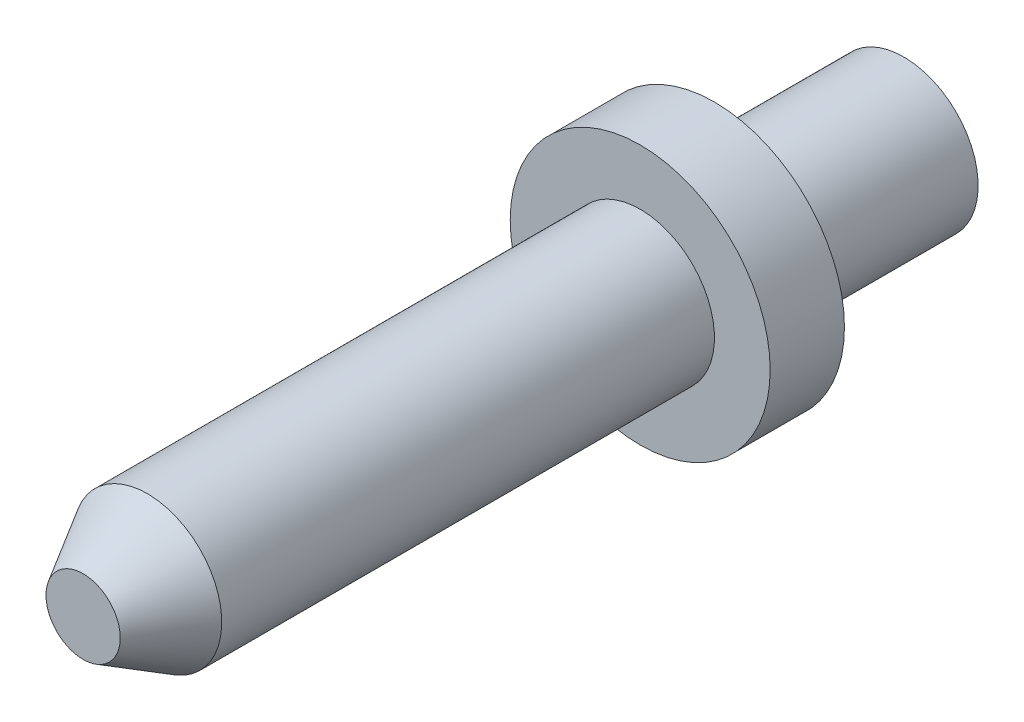
ISO-10303-21;
HEADER;
FILE_DESCRIPTION(('STEP AP214'),'2;1');
FILE_NAME('part.step','',(''),(''),'','','');
FILE_SCHEMA(('AUTOMOTIVE_DESIGN { 1 0 10303 214 1 1 1 1 }'));
ENDSEC;
DATA;
#1=APPLICATION_CONTEXT('core data for automotive mechanical design processes');
#2=APPLICATION_PROTOCOL_DEFINITION('international standard','automotive_design',2000,#1);
#3=PRODUCT_CONTEXT('',#1,'mechanical');
#4=PRODUCT('Part','Part','',(#3));
#5=PRODUCT_RELATED_PRODUCT_CATEGORY('part','',(#4));
#6=PRODUCT_DEFINITION_FORMATION('','',#4);
#7=PRODUCT_DEFINITION_CONTEXT('part definition',#1,'design');
#8=PRODUCT_DEFINITION('design','',#6,#7);
#9=PRODUCT_DEFINITION_SHAPE('','',#8);
#10=(LENGTH_UNIT() NAMED_UNIT(*) SI_UNIT(.MILLI.,.METRE.));
#11=(NAMED_UNIT(*) PLANE_ANGLE_UNIT() SI_UNIT($,.RADIAN.));
#12=(NAMED_UNIT(*) SI_UNIT($,.STERADIAN.) SOLID_ANGLE_UNIT());
#13=UNCERTAINTY_MEASURE_WITH_UNIT(LENGTH_MEASURE(1.E-05),#10,'distance_accuracy_value','');
#14=(GEOMETRIC_REPRESENTATION_CONTEXT(3) GLOBAL_UNCERTAINTY_ASSIGNED_CONTEXT((#13)) GLOBAL_UNIT_ASSIGNED_CONTEXT((#10,
#11,#12)) REPRESENTATION_CONTEXT('',''));
#15=CARTESIAN_POINT('',(0.,0.,0.));
#16=DIRECTION('',(0.,0.,1.));
#17=DIRECTION('',(1.,0.,0.));
#18=AXIS2_PLACEMENT_3D('',#15,#16,#17);
#19=CARTESIAN_POINT('',(0.,0.,-1.70210979481437));
#20=DIRECTION('',(0.,0.,-1.));
#21=DIRECTION('',(-1.,0.,0.));
#22=AXIS2_PLACEMENT_3D('',#19,#20,#21);
#23=CYLINDRICAL_SURFACE('',#22,0.508);
#24=CARTESIAN_POINT('',(0.,0.,-1.70210979481437));
#25=DIRECTION('',(0.,0.,-1.));
#26=DIRECTION('',(-1.,0.,0.));
#27=AXIS2_PLACEMENT_3D('',#24,#25,#26);
#28=CIRCLE('',#27,0.508);
#29=CARTESIAN_POINT('',(-0.508,0.,-1.70210979481437));
#30=VERTEX_POINT('',#29);
#31=EDGE_CURVE('E11',#30,#30,#28,.T.);
#32=ORIENTED_EDGE('',*,*,#31,.F.);
#33=EDGE_LOOP('',(#32));
#34=FACE_BOUND('',#33,.T.);
#35=CARTESIAN_POINT('',(0.,0.,1.66794930006314));
#36=DIRECTION('',(0.,0.,-1.));
#37=DIRECTION('',(-1.,0.,0.));
#38=AXIS2_PLACEMENT_3D('',#35,#36,#37);
#39=CIRCLE('',#38,0.508);
#40=CARTESIAN_POINT('',(-0.508,0.,1.66794930006314));
#41=VERTEX_POINT('',#40);
#42=EDGE_CURVE('E58',#41,#41,#39,.T.);
#43=ORIENTED_EDGE('',*,*,#42,.T.);
#44=EDGE_LOOP('',(#43));
#45=FACE_BOUND('',#44,.T.);
#46=ADVANCED_FACE('F32',(#34,#45),#23,.T.);
#47=CARTESIAN_POINT('',(0.,0.,-1.70210979481437));
#48=DIRECTION('',(0.,0.,-1.));
#49=DIRECTION('',(-1.,0.,0.));
#50=AXIS2_PLACEMENT_3D('',#47,#48,#49);
#51=PLANE('',#50);
#52=CARTESIAN_POINT('',(0.,0.,-1.70210979481437));
#53=DIRECTION('',(0.,0.,-1.));
#54=DIRECTION('',(-1.,0.,0.));
#55=AXIS2_PLACEMENT_3D('',#52,#53,#54);
#56=CIRCLE('',#55,0.889);
#57=CARTESIAN_POINT('',(-0.889,0.,-1.70210979481437));
#58=VERTEX_POINT('',#57);
#59=EDGE_CURVE('E38',#58,#58,#56,.T.);
#60=ORIENTED_EDGE('',*,*,#59,.F.);
#61=EDGE_LOOP('',(#60));
#62=FACE_BOUND('',#61,.T.);
#63=ORIENTED_EDGE('',*,*,#31,.T.);
#64=EDGE_LOOP('',(#63));
#65=FACE_BOUND('',#64,.T.);
#66=ADVANCED_FACE('F74',(#62,#65),#51,.F.);
#67=CARTESIAN_POINT('',(0.,0.,-1.70210979481437));
#68=DIRECTION('',(0.,0.,-1.));
#69=DIRECTION('',(-1.,0.,0.));
#70=AXIS2_PLACEMENT_3D('',#67,#68,#69);
#71=CYLINDRICAL_SURFACE('',#70,0.889);
#72=CARTESIAN_POINT('',(0.,0.,-2.21010979481437));
#73=DIRECTION('',(0.,0.,-1.));
#74=DIRECTION('',(-1.,0.,0.));
#75=AXIS2_PLACEMENT_3D('',#72,#73,#74);
#76=CIRCLE('',#75,0.889);
#77=CARTESIAN_POINT('',(-0.889,0.,-2.21010979481437));
#78=VERTEX_POINT('',#77);
#79=EDGE_CURVE('E67',#78,#78,#76,.T.);
#80=ORIENTED_EDGE('',*,*,#79,.F.);
#81=EDGE_LOOP('',(#80));
#82=FACE_BOUND('',#81,.T.);
#83=ORIENTED_EDGE('',*,*,#59,.T.);
#84=EDGE_LOOP('',(#83));
#85=FACE_BOUND('',#84,.T.);
#86=ADVANCED_FACE('F72',(#82,#85),#71,.T.);
#87=CARTESIAN_POINT('',(0.,0.,-2.21010979481437));
#88=DIRECTION('',(0.,0.,-1.));
#89=DIRECTION('',(-1.,0.,0.));
#90=AXIS2_PLACEMENT_3D('',#87,#88,#89);
#91=PLANE('',#90);
#92=ORIENTED_EDGE('',*,*,#79,.T.);
#93=EDGE_LOOP('',(#92));
#94=FACE_BOUND('',#93,.T.);
#95=CARTESIAN_POINT('',(0.,0.,-2.21010979481437));
#96=DIRECTION('',(0.,0.,-1.));
#97=DIRECTION('',(-1.,0.,0.));
#98=AXIS2_PLACEMENT_3D('',#95,#96,#97);
#99=CIRCLE('',#98,0.508);
#100=CARTESIAN_POINT('',(-0.508,0.,-2.21010979481437));
#101=VERTEX_POINT('',#100);
#102=EDGE_CURVE('E64',#101,#101,#99,.T.);
#103=ORIENTED_EDGE('',*,*,#102,.F.);
#104=EDGE_LOOP('',(#103));
#105=FACE_BOUND('',#104,.T.);
#106=ADVANCED_FACE('F103',(#94,#105),#91,.T.);
#107=CARTESIAN_POINT('',(0.,0.,-1.70210979481437));
#108=DIRECTION('',(0.,0.,-1.));
#109=DIRECTION('',(-1.,0.,0.));
#110=AXIS2_PLACEMENT_3D('',#107,#108,#109);
#111=CYLINDRICAL_SURFACE('',#110,0.508);
#112=CARTESIAN_POINT('',(0.,0.,-3.50550979481437));
#113=DIRECTION('',(0.,0.,-1.));
#114=DIRECTION('',(-1.,0.,0.));
#115=AXIS2_PLACEMENT_3D('',#112,#113,#114);
#116=CIRCLE('',#115,0.508);
#117=CARTESIAN_POINT('',(-0.508,0.,-3.50550979481437));
#118=VERTEX_POINT('',#117);
#119=EDGE_CURVE('E55',#118,#118,#116,.T.);
#120=ORIENTED_EDGE('',*,*,#119,.F.);
#121=EDGE_LOOP('',(#120));
#122=FACE_BOUND('',#121,.T.);
#123=ORIENTED_EDGE('',*,*,#102,.T.);
#124=EDGE_LOOP('',(#123));
#125=FACE_BOUND('',#124,.T.);
#126=ADVANCED_FACE('F99',(#122,#125),#111,.T.);
#127=CARTESIAN_POINT('',(0.,0.,-3.50550979481437));
#128=DIRECTION('',(0.,0.,-1.));
#129=DIRECTION('',(-1.,0.,0.));
#130=AXIS2_PLACEMENT_3D('',#127,#128,#129);
#131=PLANE('',#130);
#132=ORIENTED_EDGE('',*,*,#119,.T.);
#133=EDGE_LOOP('',(#132));
#134=FACE_BOUND('',#133,.T.);
#135=CARTESIAN_POINT('',(0.,0.,-3.50550979481437));
#136=DIRECTION('',(0.,0.,-1.));
#137=DIRECTION('',(-1.,0.,0.));
#138=AXIS2_PLACEMENT_3D('',#135,#136,#137);
#139=CIRCLE('',#138,0.3175);
#140=CARTESIAN_POINT('',(-0.3175,0.,-3.50550979481437));
#141=VERTEX_POINT('',#140);
#142=EDGE_CURVE('E51',#141,#141,#139,.T.);
#143=ORIENTED_EDGE('',*,*,#142,.F.);
#144=EDGE_LOOP('',(#143));
#145=FACE_BOUND('',#144,.T.);
#146=ADVANCED_FACE('F96',(#134,#145),#131,.T.);
#147=CARTESIAN_POINT('',(0.,0.,-1.70210979481437));
#148=DIRECTION('',(0.,0.,-1.));
#149=DIRECTION('',(-1.,0.,0.));
#150=AXIS2_PLACEMENT_3D('',#147,#148,#149);
#151=CYLINDRICAL_SURFACE('',#150,0.3175);
#152=CARTESIAN_POINT('',(0.,0.,-2.48950979481437));
#153=DIRECTION('',(0.,0.,-1.));
#154=DIRECTION('',(-1.,0.,0.));
#155=AXIS2_PLACEMENT_3D('',#152,#153,#154);
#156=CIRCLE('',#155,0.3175);
#157=CARTESIAN_POINT('',(-0.3175,0.,-2.48950979481437));
#158=VERTEX_POINT('',#157);
#159=EDGE_CURVE('E49',#158,#158,#156,.T.);
#160=ORIENTED_EDGE('',*,*,#159,.F.);
#161=EDGE_LOOP('',(#160));
#162=FACE_BOUND('',#161,.T.);
#163=ORIENTED_EDGE('',*,*,#142,.T.);
#164=EDGE_LOOP('',(#163));
#165=FACE_BOUND('',#164,.T.);
#166=ADVANCED_FACE('F45',(#162,#165),#151,.F.);
#167=CARTESIAN_POINT('',(0.,0.,-2.48950979481437));
#168=DIRECTION('',(0.,0.,-1.));
#169=DIRECTION('',(-1.,0.,0.));
#170=AXIS2_PLACEMENT_3D('',#167,#168,#169);
#171=CONICAL_SURFACE('',#170,0.3175,1.08210413623649);
#172=CARTESIAN_POINT('',(0.,0.,-2.32069205026185));
#173=VERTEX_POINT('',#172);
#174=VERTEX_LOOP('',#173);
#175=FACE_BOUND('',#174,.T.);
#176=ORIENTED_EDGE('',*,*,#159,.T.);
#177=EDGE_LOOP('',(#176));
#178=FACE_BOUND('',#177,.T.);
#179=ADVANCED_FACE('F41',(#175,#178),#171,.F.);
#180=CARTESIAN_POINT('',(0.,0.,2.10789020518563));
#181=DIRECTION('',(0.,0.,-1.));
#182=DIRECTION('',(-1.,0.,0.));
#183=AXIS2_PLACEMENT_3D('',#180,#181,#182);
#184=PLANE('',#183);
#185=CARTESIAN_POINT('',(0.,0.,2.10789020518563));
#186=DIRECTION('',(0.,0.,-1.));
#187=DIRECTION('',(-1.,0.,0.));
#188=AXIS2_PLACEMENT_3D('',#185,#186,#187);
#189=CIRCLE('',#188,0.254);
#190=CARTESIAN_POINT('',(-0.253999999999999,0.,2.10789020518563));
#191=VERTEX_POINT('',#190);
#192=EDGE_CURVE('E52',#191,#191,#189,.T.);
#193=ORIENTED_EDGE('',*,*,#192,.F.);
#194=EDGE_LOOP('',(#193));
#195=FACE_BOUND('',#194,.T.);
#196=ADVANCED_FACE('F44',(#195),#184,.F.);
#197=CARTESIAN_POINT('',(0.,0.,1.66794930006314));
#198=DIRECTION('',(0.,0.,-1.));
#199=DIRECTION('',(-1.,0.,0.));
#200=AXIS2_PLACEMENT_3D('',#197,#198,#199);
#201=CONICAL_SURFACE('',#200,0.508,0.523598775598304);
#202=ORIENTED_EDGE('',*,*,#192,.T.);
#203=EDGE_LOOP('',(#202));
#204=FACE_BOUND('',#203,.T.);
#205=ORIENTED_EDGE('',*,*,#42,.F.);
#206=EDGE_LOOP('',(#205));
#207=FACE_BOUND('',#206,.T.);
#208=ADVANCED_FACE('F84',(#204,#207),#201,.T.);
#209=CLOSED_SHELL('',(#46,#66,#86,#106,#126,#146,#166,#179,#196,#208));
#210=MANIFOLD_SOLID_BREP('B2',#209);
#211=ADVANCED_BREP_SHAPE_REPRESENTATION('',(#18,#210),#14);
#212=SHAPE_DEFINITION_REPRESENTATION(#9,#211);
ENDSEC;
END-ISO-10303-21;
